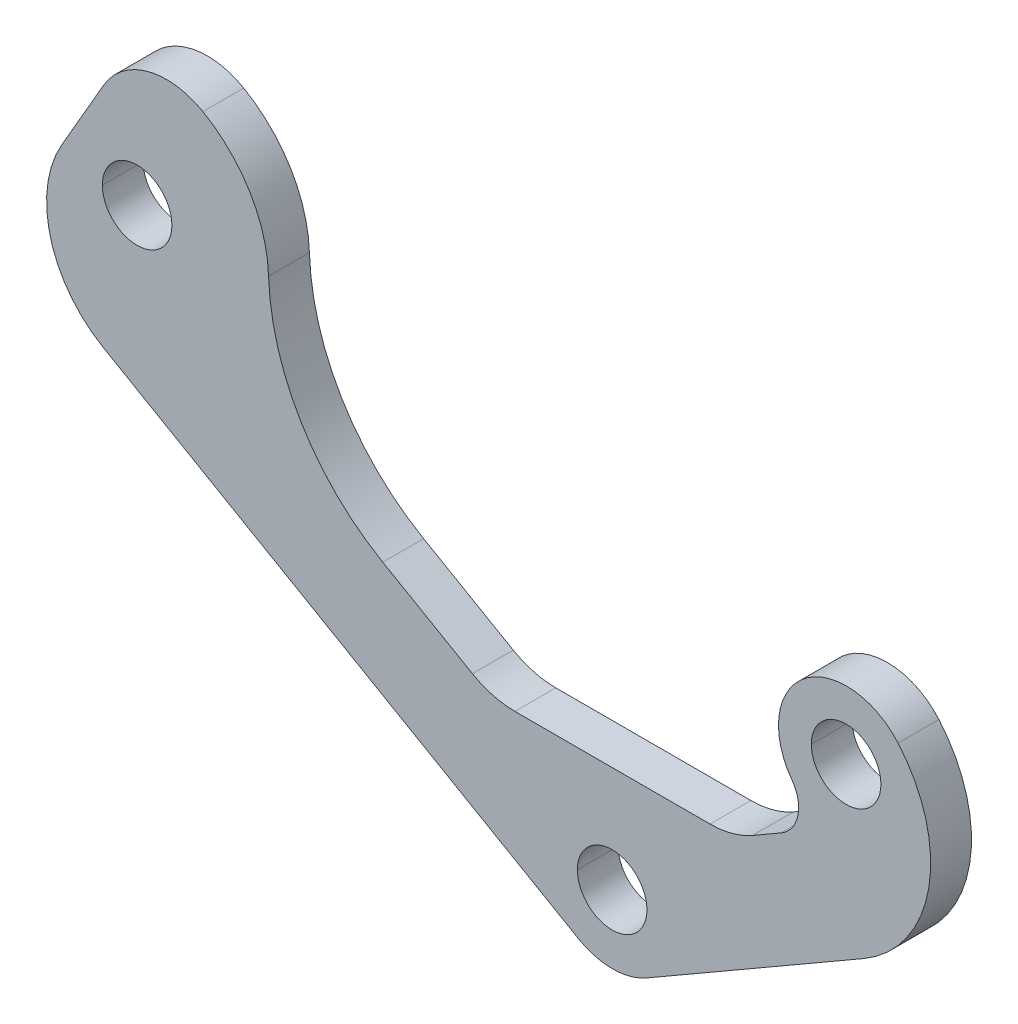
ISO-10303-21;
HEADER;
FILE_DESCRIPTION(('STEP AP214'),'2;1');
FILE_NAME('part.step','',(''),(''),'','','');
FILE_SCHEMA(('AUTOMOTIVE_DESIGN { 1 0 10303 214 1 1 1 1 }'));
ENDSEC;
DATA;
#1=APPLICATION_CONTEXT('core data for automotive mechanical design processes');
#2=APPLICATION_PROTOCOL_DEFINITION('international standard','automotive_design',2000,#1);
#3=PRODUCT_CONTEXT('',#1,'mechanical');
#4=PRODUCT('Part','Part','',(#3));
#5=PRODUCT_RELATED_PRODUCT_CATEGORY('part','',(#4));
#6=PRODUCT_DEFINITION_FORMATION('','',#4);
#7=PRODUCT_DEFINITION_CONTEXT('part definition',#1,'design');
#8=PRODUCT_DEFINITION('design','',#6,#7);
#9=PRODUCT_DEFINITION_SHAPE('','',#8);
#10=(LENGTH_UNIT() NAMED_UNIT(*) SI_UNIT(.MILLI.,.METRE.));
#11=(NAMED_UNIT(*) PLANE_ANGLE_UNIT() SI_UNIT($,.RADIAN.));
#12=(NAMED_UNIT(*) SI_UNIT($,.STERADIAN.) SOLID_ANGLE_UNIT());
#13=UNCERTAINTY_MEASURE_WITH_UNIT(LENGTH_MEASURE(1.E-05),#10,'distance_accuracy_value','');
#14=(GEOMETRIC_REPRESENTATION_CONTEXT(3) GLOBAL_UNCERTAINTY_ASSIGNED_CONTEXT((#13)) GLOBAL_UNIT_ASSIGNED_CONTEXT((#10,
#11,#12)) REPRESENTATION_CONTEXT('',''));
#15=CARTESIAN_POINT('',(0.,0.,0.));
#16=DIRECTION('',(0.,0.,1.));
#17=DIRECTION('',(1.,0.,0.));
#18=AXIS2_PLACEMENT_3D('',#15,#16,#17);
#19=CARTESIAN_POINT('',(7.51000105614217,0.660674934064332,-15.42));
#20=DIRECTION('',(0.,0.,1.));
#21=DIRECTION('',(1.,0.,0.));
#22=AXIS2_PLACEMENT_3D('',#19,#20,#21);
#23=PLANE('',#22);
#24=CARTESIAN_POINT('',(-2.3,5.71,-15.42));
#25=DIRECTION('',(0.,0.,-1.));
#26=DIRECTION('',(-1.,0.,0.));
#27=AXIS2_PLACEMENT_3D('',#24,#25,#26);
#28=CIRCLE('',#27,0.9741);
#29=CARTESIAN_POINT('',(-3.2741,5.71,-15.42));
#30=VERTEX_POINT('',#29);
#31=CARTESIAN_POINT('',(-1.3259,5.71,-15.42));
#32=VERTEX_POINT('',#31);
#33=EDGE_CURVE('E503',#30,#32,#28,.T.);
#34=ORIENTED_EDGE('',*,*,#33,.T.);
#35=CARTESIAN_POINT('',(-2.3,5.71,-15.42));
#36=DIRECTION('',(0.,0.,-1.));
#37=DIRECTION('',(-1.,0.,0.));
#38=AXIS2_PLACEMENT_3D('',#35,#36,#37);
#39=CIRCLE('',#38,0.9741);
#40=EDGE_CURVE('E677',#32,#30,#39,.T.);
#41=ORIENTED_EDGE('',*,*,#40,.T.);
#42=EDGE_LOOP('',(#34,#41));
#43=FACE_BOUND('',#42,.T.);
#44=CARTESIAN_POINT('',(11.,-4.24,-15.42));
#45=DIRECTION('',(0.,0.,-1.));
#46=DIRECTION('',(-1.,0.,0.));
#47=AXIS2_PLACEMENT_3D('',#44,#45,#46);
#48=CIRCLE('',#47,0.9741);
#49=CARTESIAN_POINT('',(10.0259,-4.24,-15.42));
#50=VERTEX_POINT('',#49);
#51=CARTESIAN_POINT('',(11.9741,-4.24,-15.42));
#52=VERTEX_POINT('',#51);
#53=EDGE_CURVE('E370',#50,#52,#48,.T.);
#54=ORIENTED_EDGE('',*,*,#53,.T.);
#55=CARTESIAN_POINT('',(11.,-4.24,-15.42));
#56=DIRECTION('',(0.,0.,-1.));
#57=DIRECTION('',(-1.,0.,0.));
#58=AXIS2_PLACEMENT_3D('',#55,#56,#57);
#59=CIRCLE('',#58,0.9741);
#60=EDGE_CURVE('E401',#52,#50,#59,.T.);
#61=ORIENTED_EDGE('',*,*,#60,.T.);
#62=EDGE_LOOP('',(#54,#61));
#63=FACE_BOUND('',#62,.T.);
#64=CARTESIAN_POINT('',(17.55,2.08,-15.42));
#65=DIRECTION('',(0.,0.,-1.));
#66=DIRECTION('',(-1.,0.,0.));
#67=AXIS2_PLACEMENT_3D('',#64,#65,#66);
#68=CIRCLE('',#67,0.9741);
#69=CARTESIAN_POINT('',(16.5759,2.08,-15.42));
#70=VERTEX_POINT('',#69);
#71=CARTESIAN_POINT('',(18.5241,2.08,-15.42));
#72=VERTEX_POINT('',#71);
#73=EDGE_CURVE('E371',#70,#72,#68,.T.);
#74=ORIENTED_EDGE('',*,*,#73,.T.);
#75=CARTESIAN_POINT('',(17.55,2.08,-15.42));
#76=DIRECTION('',(0.,0.,-1.));
#77=DIRECTION('',(-1.,0.,0.));
#78=AXIS2_PLACEMENT_3D('',#75,#76,#77);
#79=CIRCLE('',#78,0.9741);
#80=EDGE_CURVE('E508',#72,#70,#79,.T.);
#81=ORIENTED_EDGE('',*,*,#80,.T.);
#82=EDGE_LOOP('',(#74,#81));
#83=FACE_BOUND('',#82,.T.);
#84=CARTESIAN_POINT('',(16.1585293339652,0.866981467125824,-15.42));
#85=DIRECTION('',(0.,0.,-1.));
#86=DIRECTION('',(0.499999997303724,-0.866025405341134,0.));
#87=AXIS2_PLACEMENT_3D('',#84,#85,#86);
#88=CIRCLE('',#87,3.75919999234137);
#89=CARTESIAN_POINT('',(19.00554384,3.32179163999999,-15.42));
#90=VERTEX_POINT('',#89);
#91=CARTESIAN_POINT('',(18.03812932,-2.38858123,-15.42));
#92=VERTEX_POINT('',#91);
#93=EDGE_CURVE('E496',#90,#92,#88,.T.);
#94=ORIENTED_EDGE('',*,*,#93,.F.);
#95=CARTESIAN_POINT('',(17.5627999996952,2.07779999667694,-15.42));
#96=DIRECTION('',(0.,0.,-1.));
#97=DIRECTION('',(0.757345848200842,0.653013986230729,0.));
#98=AXIS2_PLACEMENT_3D('',#95,#96,#97);
#99=CIRCLE('',#98,1.90499999931627);
#100=CARTESIAN_POINT('',(16.02880772,0.9482458,-15.42));
#101=VERTEX_POINT('',#100);
#102=EDGE_CURVE('E21',#101,#90,#99,.T.);
#103=ORIENTED_EDGE('',*,*,#102,.F.);
#104=CARTESIAN_POINT('',(15.2311317334779,0.360877614219627,-15.42));
#105=DIRECTION('',(0.,0.,1.));
#106=DIRECTION('',(0.50000000527427,-0.866025400739337,0.));
#107=AXIS2_PLACEMENT_3D('',#104,#105,#106);
#108=CIRCLE('',#107,0.990600002594888);
#109=CARTESIAN_POINT('',(15.72643174,-0.497007149999999,-15.42));
#110=VERTEX_POINT('',#109);
#111=EDGE_CURVE('E221',#110,#101,#108,.T.);
#112=ORIENTED_EDGE('',*,*,#111,.F.);
#113=DIRECTION('',(0.866025405467971,0.499999997084036,0.));
#114=VECTOR('',#113,1.);
#115=CARTESIAN_POINT('',(15.72643174,-0.49700715,-15.42));
#116=LINE('',#115,#114);
#117=CARTESIAN_POINT('',(14.93147958,-0.95597299,-15.42));
#118=VERTEX_POINT('',#117);
#119=EDGE_CURVE('E224',#118,#110,#116,.T.);
#120=ORIENTED_EDGE('',*,*,#119,.F.);
#121=CARTESIAN_POINT('',(13.7408545541055,1.10625007878791,-15.42));
#122=DIRECTION('',(0.,0.,1.));
#123=DIRECTION('',(1.08743515578238E-08,-1.,0.));
#124=AXIS2_PLACEMENT_3D('',#121,#122,#123);
#125=CIRCLE('',#124,2.38125007878791);
#126=CARTESIAN_POINT('',(13.74085458,-1.275,-15.42));
#127=VERTEX_POINT('',#126);
#128=EDGE_CURVE('E315',#127,#118,#125,.T.);
#129=ORIENTED_EDGE('',*,*,#128,.F.);
#130=DIRECTION('',(1.,0.,0.));
#131=VECTOR('',#130,1.);
#132=CARTESIAN_POINT('',(13.74085458,-1.275,-15.42));
#133=LINE('',#132,#131);
#134=CARTESIAN_POINT('',(8.27834543,-1.275,-15.42));
#135=VERTEX_POINT('',#134);
#136=EDGE_CURVE('E306',#135,#127,#133,.T.);
#137=ORIENTED_EDGE('',*,*,#136,.F.);
#138=CARTESIAN_POINT('',(8.27834545589454,1.10625007878786,-15.42));
#139=DIRECTION('',(0.,0.,1.));
#140=DIRECTION('',(-0.499999994330964,-0.866025407057458,0.));
#141=AXIS2_PLACEMENT_3D('',#138,#139,#140);
#142=CIRCLE('',#141,2.38125007878786);
#143=CARTESIAN_POINT('',(7.08772043,-0.95597299,-15.42));
#144=VERTEX_POINT('',#143);
#145=EDGE_CURVE('E252',#144,#135,#142,.T.);
#146=ORIENTED_EDGE('',*,*,#145,.F.);
#147=DIRECTION('',(0.866025404251055,-0.499999999191797,0.));
#148=VECTOR('',#147,1.);
#149=CARTESIAN_POINT('',(7.08772043,-0.95597299,-15.42));
#150=LINE('',#149,#148);
#151=CARTESIAN_POINT('',(4.57812253,0.49294403,-15.42));
#152=VERTEX_POINT('',#151);
#153=EDGE_CURVE('E302',#152,#144,#150,.T.);
#154=ORIENTED_EDGE('',*,*,#153,.F.);
#155=CARTESIAN_POINT('',(7.77852249617024,6.03619941573465,-15.42));
#156=DIRECTION('',(0.,0.,1.));
#157=DIRECTION('',(-0.999476638757128,-0.032348857456686,0.));
#158=AXIS2_PLACEMENT_3D('',#155,#156,#157);
#159=CIRCLE('',#158,6.40079996679623);
#160=CARTESIAN_POINT('',(1.38107246,5.82914085,-15.42));
#161=VERTEX_POINT('',#160);
#162=EDGE_CURVE('E288',#161,#152,#159,.T.);
#163=ORIENTED_EDGE('',*,*,#162,.F.);
#164=CARTESIAN_POINT('',(-2.30000000670923,5.70999999409976,-15.42));
#165=DIRECTION('',(0.,0.,-1.));
#166=DIRECTION('',(0.999476638636968,0.0323488611692441,0.));
#167=AXIS2_PLACEMENT_3D('',#164,#165,#166);
#168=CIRCLE('',#167,3.68300000661274);
#169=CARTESIAN_POINT('',(-0.4585,8.89957156,-15.42));
#170=VERTEX_POINT('',#169);
#171=EDGE_CURVE('E280',#170,#161,#168,.T.);
#172=ORIENTED_EDGE('',*,*,#171,.F.);
#173=CARTESIAN_POINT('',(-1.47450000129241,7.13980794482333,-15.42));
#174=DIRECTION('',(0.,0.,-1.));
#175=DIRECTION('',(0.500000001609269,0.866025402855327,0.));
#176=AXIS2_PLACEMENT_3D('',#173,#174,#175);
#177=CIRCLE('',#176,2.03199999604474);
#178=CARTESIAN_POINT('',(-3.23426362,8.15580794,-15.42));
#179=VERTEX_POINT('',#178);
#180=EDGE_CURVE('E272',#179,#170,#177,.T.);
#181=ORIENTED_EDGE('',*,*,#180,.F.);
#182=DIRECTION('',(0.500000000256227,0.866025403636506,0.));
#183=VECTOR('',#182,1.);
#184=CARTESIAN_POINT('',(-3.23426362,8.15580794,-15.42));
#185=LINE('',#184,#183);
#186=CARTESIAN_POINT('',(-4.40878449,6.12147812,-15.42));
#187=VERTEX_POINT('',#186);
#188=EDGE_CURVE('E263',#187,#179,#185,.T.);
#189=ORIENTED_EDGE('',*,*,#188,.F.);
#190=CARTESIAN_POINT('',(-1.65915383789321,4.53397812056451,-15.42));
#191=DIRECTION('',(0.,0.,-1.));
#192=DIRECTION('',(-0.866025404262309,0.499999999172305,0.));
#193=AXIS2_PLACEMENT_3D('',#190,#191,#192);
#194=CIRCLE('',#193,3.17500000412684);
#195=CARTESIAN_POINT('',(-3.24665383999999,1.78434746,-15.42));
#196=VERTEX_POINT('',#195);
#197=EDGE_CURVE('E246',#196,#187,#194,.T.);
#198=ORIENTED_EDGE('',*,*,#197,.F.);
#199=DIRECTION('',(-0.866025403643022,0.500000000244941,0.));
#200=VECTOR('',#199,1.);
#201=CARTESIAN_POINT('',(-3.24665384,1.78434746,-15.42));
#202=LINE('',#201,#200);
#203=CARTESIAN_POINT('',(10.05709999,-5.8965784,-15.42));
#204=VERTEX_POINT('',#203);
#205=EDGE_CURVE('E422',#204,#196,#202,.T.);
#206=ORIENTED_EDGE('',*,*,#205,.F.);
#207=CARTESIAN_POINT('',(11.00959999,-4.2468000372097,-15.42));
#208=DIRECTION('',(0.,0.,-1.));
#209=DIRECTION('',(-0.500000007141655,-0.866025399661202,0.));
#210=AXIS2_PLACEMENT_3D('',#207,#208,#209);
#211=CIRCLE('',#210,1.9049999727903);
#212=CARTESIAN_POINT('',(11.96209999,-5.8965784,-15.42));
#213=VERTEX_POINT('',#212);
#214=EDGE_CURVE('E448',#213,#204,#211,.T.);
#215=ORIENTED_EDGE('',*,*,#214,.F.);
#216=DIRECTION('',(-0.866025403739975,-0.500000000077014,0.));
#217=VECTOR('',#216,1.);
#218=CARTESIAN_POINT('',(11.96209999,-5.8965784,-15.42));
#219=LINE('',#218,#217);
#220=EDGE_CURVE('E440',#92,#213,#219,.T.);
#221=ORIENTED_EDGE('',*,*,#220,.F.);
#222=EDGE_LOOP('',(#94,#103,#112,#120,#129,#137,#146,#154,#163,#172,#181,#189,#198,#206,#215,#221));
#223=FACE_BOUND('',#222,.T.);
#224=ADVANCED_FACE('F17',(#43,#63,#83,#223),#23,.T.);
#225=CARTESIAN_POINT('',(7.51000105614217,0.660674934064333,-16.563));
#226=DIRECTION('',(0.,0.,1.));
#227=DIRECTION('',(1.,0.,0.));
#228=AXIS2_PLACEMENT_3D('',#225,#226,#227);
#229=PLANE('',#228);
#230=CARTESIAN_POINT('',(-2.3,5.71,-16.563));
#231=DIRECTION('',(0.,0.,1.));
#232=DIRECTION('',(-1.,0.,0.));
#233=AXIS2_PLACEMENT_3D('',#230,#231,#232);
#234=CIRCLE('',#233,0.9741);
#235=CARTESIAN_POINT('',(-3.2741,5.71,-16.563));
#236=VERTEX_POINT('',#235);
#237=CARTESIAN_POINT('',(-1.3259,5.71,-16.563));
#238=VERTEX_POINT('',#237);
#239=EDGE_CURVE('E410',#236,#238,#234,.T.);
#240=ORIENTED_EDGE('',*,*,#239,.T.);
#241=CARTESIAN_POINT('',(-2.3,5.71,-16.563));
#242=DIRECTION('',(0.,0.,1.));
#243=DIRECTION('',(-1.,0.,0.));
#244=AXIS2_PLACEMENT_3D('',#241,#242,#243);
#245=CIRCLE('',#244,0.9741);
#246=EDGE_CURVE('E394',#238,#236,#245,.T.);
#247=ORIENTED_EDGE('',*,*,#246,.T.);
#248=EDGE_LOOP('',(#240,#247));
#249=FACE_BOUND('',#248,.T.);
#250=CARTESIAN_POINT('',(11.,-4.24,-16.563));
#251=DIRECTION('',(0.,0.,1.));
#252=DIRECTION('',(-1.,0.,0.));
#253=AXIS2_PLACEMENT_3D('',#250,#251,#252);
#254=CIRCLE('',#253,0.9741);
#255=CARTESIAN_POINT('',(10.0259,-4.24,-16.563));
#256=VERTEX_POINT('',#255);
#257=CARTESIAN_POINT('',(11.9741,-4.24,-16.563));
#258=VERTEX_POINT('',#257);
#259=EDGE_CURVE('E376',#256,#258,#254,.T.);
#260=ORIENTED_EDGE('',*,*,#259,.T.);
#261=CARTESIAN_POINT('',(11.,-4.24,-16.563));
#262=DIRECTION('',(0.,0.,1.));
#263=DIRECTION('',(-1.,0.,0.));
#264=AXIS2_PLACEMENT_3D('',#261,#262,#263);
#265=CIRCLE('',#264,0.9741);
#266=EDGE_CURVE('E367',#258,#256,#265,.T.);
#267=ORIENTED_EDGE('',*,*,#266,.T.);
#268=EDGE_LOOP('',(#260,#267));
#269=FACE_BOUND('',#268,.T.);
#270=CARTESIAN_POINT('',(17.55,2.08,-16.563));
#271=DIRECTION('',(0.,0.,1.));
#272=DIRECTION('',(-1.,0.,0.));
#273=AXIS2_PLACEMENT_3D('',#270,#271,#272);
#274=CIRCLE('',#273,0.9741);
#275=CARTESIAN_POINT('',(16.5759,2.08,-16.563));
#276=VERTEX_POINT('',#275);
#277=CARTESIAN_POINT('',(18.5241,2.08,-16.563));
#278=VERTEX_POINT('',#277);
#279=EDGE_CURVE('E523',#276,#278,#274,.T.);
#280=ORIENTED_EDGE('',*,*,#279,.T.);
#281=CARTESIAN_POINT('',(17.55,2.08,-16.563));
#282=DIRECTION('',(0.,0.,1.));
#283=DIRECTION('',(-1.,0.,0.));
#284=AXIS2_PLACEMENT_3D('',#281,#282,#283);
#285=CIRCLE('',#284,0.9741);
#286=EDGE_CURVE('E478',#278,#276,#285,.T.);
#287=ORIENTED_EDGE('',*,*,#286,.T.);
#288=EDGE_LOOP('',(#280,#287));
#289=FACE_BOUND('',#288,.T.);
#290=CARTESIAN_POINT('',(17.5627999996952,2.07779999667694,-16.563));
#291=DIRECTION('',(0.,0.,1.));
#292=DIRECTION('',(0.757345848200842,0.653013986230729,0.));
#293=AXIS2_PLACEMENT_3D('',#290,#291,#292);
#294=CIRCLE('',#293,1.90499999931627);
#295=CARTESIAN_POINT('',(19.00554384,3.32179163999999,-16.563));
#296=VERTEX_POINT('',#295);
#297=CARTESIAN_POINT('',(16.02880772,0.9482458,-16.563));
#298=VERTEX_POINT('',#297);
#299=EDGE_CURVE('E11',#296,#298,#294,.T.);
#300=ORIENTED_EDGE('',*,*,#299,.F.);
#301=CARTESIAN_POINT('',(16.1585293339652,0.866981467125824,-16.563));
#302=DIRECTION('',(0.,0.,1.));
#303=DIRECTION('',(0.499999997303724,-0.866025405341134,0.));
#304=AXIS2_PLACEMENT_3D('',#301,#302,#303);
#305=CIRCLE('',#304,3.75919999234137);
#306=CARTESIAN_POINT('',(18.03812932,-2.38858123,-16.563));
#307=VERTEX_POINT('',#306);
#308=EDGE_CURVE('E472',#307,#296,#305,.T.);
#309=ORIENTED_EDGE('',*,*,#308,.F.);
#310=DIRECTION('',(0.866025403739975,0.500000000077014,0.));
#311=VECTOR('',#310,1.);
#312=CARTESIAN_POINT('',(11.96209999,-5.8965784,-16.563));
#313=LINE('',#312,#311);
#314=CARTESIAN_POINT('',(11.96209999,-5.8965784,-16.563));
#315=VERTEX_POINT('',#314);
#316=EDGE_CURVE('E439',#315,#307,#313,.T.);
#317=ORIENTED_EDGE('',*,*,#316,.F.);
#318=CARTESIAN_POINT('',(11.00959999,-4.2468000372097,-16.563));
#319=DIRECTION('',(0.,0.,1.));
#320=DIRECTION('',(-0.500000007141655,-0.866025399661202,0.));
#321=AXIS2_PLACEMENT_3D('',#318,#319,#320);
#322=CIRCLE('',#321,1.9049999727903);
#323=CARTESIAN_POINT('',(10.05709999,-5.8965784,-16.563));
#324=VERTEX_POINT('',#323);
#325=EDGE_CURVE('E420',#324,#315,#322,.T.);
#326=ORIENTED_EDGE('',*,*,#325,.F.);
#327=DIRECTION('',(0.866025403643022,-0.500000000244941,0.));
#328=VECTOR('',#327,1.);
#329=CARTESIAN_POINT('',(-3.24665384,1.78434746,-16.563));
#330=LINE('',#329,#328);
#331=CARTESIAN_POINT('',(-3.24665383999999,1.78434746,-16.563));
#332=VERTEX_POINT('',#331);
#333=EDGE_CURVE('E243',#332,#324,#330,.T.);
#334=ORIENTED_EDGE('',*,*,#333,.F.);
#335=CARTESIAN_POINT('',(-1.65915383789321,4.53397812056451,-16.563));
#336=DIRECTION('',(0.,0.,1.));
#337=DIRECTION('',(-0.866025404262309,0.499999999172305,0.));
#338=AXIS2_PLACEMENT_3D('',#335,#336,#337);
#339=CIRCLE('',#338,3.17500000412684);
#340=CARTESIAN_POINT('',(-4.40878449,6.12147812,-16.563));
#341=VERTEX_POINT('',#340);
#342=EDGE_CURVE('E260',#341,#332,#339,.T.);
#343=ORIENTED_EDGE('',*,*,#342,.F.);
#344=DIRECTION('',(-0.500000000256227,-0.866025403636506,0.));
#345=VECTOR('',#344,1.);
#346=CARTESIAN_POINT('',(-3.23426362,8.15580794,-16.563));
#347=LINE('',#346,#345);
#348=CARTESIAN_POINT('',(-3.23426362,8.15580794,-16.563));
#349=VERTEX_POINT('',#348);
#350=EDGE_CURVE('E270',#349,#341,#347,.T.);
#351=ORIENTED_EDGE('',*,*,#350,.F.);
#352=CARTESIAN_POINT('',(-1.47450000129241,7.13980794482333,-16.563));
#353=DIRECTION('',(0.,0.,1.));
#354=DIRECTION('',(0.500000001609269,0.866025402855327,0.));
#355=AXIS2_PLACEMENT_3D('',#352,#353,#354);
#356=CIRCLE('',#355,2.03199999604474);
#357=CARTESIAN_POINT('',(-0.4585,8.89957156,-16.563));
#358=VERTEX_POINT('',#357);
#359=EDGE_CURVE('E277',#358,#349,#356,.T.);
#360=ORIENTED_EDGE('',*,*,#359,.F.);
#361=CARTESIAN_POINT('',(-2.30000000670923,5.70999999409976,-16.563));
#362=DIRECTION('',(0.,0.,1.));
#363=DIRECTION('',(0.999476638636968,0.0323488611692441,0.));
#364=AXIS2_PLACEMENT_3D('',#361,#362,#363);
#365=CIRCLE('',#364,3.68300000661274);
#366=CARTESIAN_POINT('',(1.38107246,5.82914085,-16.563));
#367=VERTEX_POINT('',#366);
#368=EDGE_CURVE('E285',#367,#358,#365,.T.);
#369=ORIENTED_EDGE('',*,*,#368,.F.);
#370=CARTESIAN_POINT('',(7.77852249617024,6.03619941573465,-16.563));
#371=DIRECTION('',(0.,0.,1.));
#372=DIRECTION('',(-0.999476638757128,-0.032348857456686,0.));
#373=AXIS2_PLACEMENT_3D('',#370,#371,#372);
#374=CIRCLE('',#373,6.40079996679623);
#375=CARTESIAN_POINT('',(4.57812253,0.49294403,-16.563));
#376=VERTEX_POINT('',#375);
#377=EDGE_CURVE('E296',#367,#376,#374,.T.);
#378=ORIENTED_EDGE('',*,*,#377,.T.);
#379=DIRECTION('',(-0.866025404251055,0.499999999191797,0.));
#380=VECTOR('',#379,1.);
#381=CARTESIAN_POINT('',(7.08772043,-0.95597299,-16.563));
#382=LINE('',#381,#380);
#383=CARTESIAN_POINT('',(7.08772043,-0.95597299,-16.563));
#384=VERTEX_POINT('',#383);
#385=EDGE_CURVE('E301',#384,#376,#382,.T.);
#386=ORIENTED_EDGE('',*,*,#385,.F.);
#387=CARTESIAN_POINT('',(8.27834545589454,1.10625007878786,-16.563));
#388=DIRECTION('',(0.,0.,1.));
#389=DIRECTION('',(-0.499999994330964,-0.866025407057458,0.));
#390=AXIS2_PLACEMENT_3D('',#387,#388,#389);
#391=CIRCLE('',#390,2.38125007878786);
#392=CARTESIAN_POINT('',(8.27834543,-1.275,-16.563));
#393=VERTEX_POINT('',#392);
#394=EDGE_CURVE('E251',#384,#393,#391,.T.);
#395=ORIENTED_EDGE('',*,*,#394,.T.);
#396=DIRECTION('',(-1.,0.,0.));
#397=VECTOR('',#396,1.);
#398=CARTESIAN_POINT('',(13.74085458,-1.275,-16.563));
#399=LINE('',#398,#397);
#400=CARTESIAN_POINT('',(13.74085458,-1.275,-16.563));
#401=VERTEX_POINT('',#400);
#402=EDGE_CURVE('E314',#401,#393,#399,.T.);
#403=ORIENTED_EDGE('',*,*,#402,.F.);
#404=CARTESIAN_POINT('',(13.7408545541055,1.10625007878791,-16.563));
#405=DIRECTION('',(0.,0.,1.));
#406=DIRECTION('',(1.08743515578238E-08,-1.,0.));
#407=AXIS2_PLACEMENT_3D('',#404,#405,#406);
#408=CIRCLE('',#407,2.38125007878791);
#409=CARTESIAN_POINT('',(14.93147958,-0.95597299,-16.563));
#410=VERTEX_POINT('',#409);
#411=EDGE_CURVE('E216',#401,#410,#408,.T.);
#412=ORIENTED_EDGE('',*,*,#411,.T.);
#413=DIRECTION('',(-0.866025405467971,-0.499999997084036,0.));
#414=VECTOR('',#413,1.);
#415=CARTESIAN_POINT('',(15.72643174,-0.49700715,-16.563));
#416=LINE('',#415,#414);
#417=CARTESIAN_POINT('',(15.72643174,-0.497007149999999,-16.563));
#418=VERTEX_POINT('',#417);
#419=EDGE_CURVE('E214',#418,#410,#416,.T.);
#420=ORIENTED_EDGE('',*,*,#419,.F.);
#421=CARTESIAN_POINT('',(15.2311317334779,0.360877614219627,-16.563));
#422=DIRECTION('',(0.,0.,1.));
#423=DIRECTION('',(0.50000000527427,-0.866025400739337,0.));
#424=AXIS2_PLACEMENT_3D('',#421,#422,#423);
#425=CIRCLE('',#424,0.990600002594888);
#426=EDGE_CURVE('E202',#418,#298,#425,.T.);
#427=ORIENTED_EDGE('',*,*,#426,.T.);
#428=EDGE_LOOP('',(#300,#309,#317,#326,#334,#343,#351,#360,#369,#378,#386,#395,#403,#412,#420,#427));
#429=FACE_BOUND('',#428,.T.);
#430=ADVANCED_FACE('F19',(#249,#269,#289,#429),#229,.F.);
#431=CARTESIAN_POINT('',(17.5627999996952,2.07779999667694,-16.563));
#432=DIRECTION('',(0.,0.,1.));
#433=DIRECTION('',(0.757345848200842,0.653013986230729,0.));
#434=AXIS2_PLACEMENT_3D('',#431,#432,#433);
#435=CYLINDRICAL_SURFACE('',#434,1.90499999931627);
#436=ORIENTED_EDGE('',*,*,#102,.T.);
#437=DIRECTION('',(0.,0.,1.));
#438=VECTOR('',#437,1.);
#439=CARTESIAN_POINT('',(19.00554384,3.32179163999999,-16.563));
#440=LINE('',#439,#438);
#441=EDGE_CURVE('E468',#296,#90,#440,.T.);
#442=ORIENTED_EDGE('',*,*,#441,.F.);
#443=ORIENTED_EDGE('',*,*,#299,.T.);
#444=DIRECTION('',(0.,0.,1.));
#445=VECTOR('',#444,1.);
#446=CARTESIAN_POINT('',(16.02880772,0.9482458,-16.563));
#447=LINE('',#446,#445);
#448=EDGE_CURVE('E209',#298,#101,#447,.T.);
#449=ORIENTED_EDGE('',*,*,#448,.T.);
#450=EDGE_LOOP('',(#436,#442,#443,#449));
#451=FACE_BOUND('',#450,.T.);
#452=ADVANCED_FACE('F922',(#451),#435,.T.);
#453=CARTESIAN_POINT('',(15.2311317334779,0.360877614219627,-16.563));
#454=DIRECTION('',(0.,0.,1.));
#455=DIRECTION('',(0.50000000527427,-0.866025400739337,0.));
#456=AXIS2_PLACEMENT_3D('',#453,#454,#455);
#457=CYLINDRICAL_SURFACE('',#456,0.990600002594888);
#458=ORIENTED_EDGE('',*,*,#111,.T.);
#459=ORIENTED_EDGE('',*,*,#448,.F.);
#460=ORIENTED_EDGE('',*,*,#426,.F.);
#461=DIRECTION('',(0.,0.,1.));
#462=VECTOR('',#461,1.);
#463=CARTESIAN_POINT('',(15.72643174,-0.497007149999999,-16.563));
#464=LINE('',#463,#462);
#465=EDGE_CURVE('E207',#418,#110,#464,.T.);
#466=ORIENTED_EDGE('',*,*,#465,.T.);
#467=EDGE_LOOP('',(#458,#459,#460,#466));
#468=FACE_BOUND('',#467,.T.);
#469=ADVANCED_FACE('F205',(#468),#457,.F.);
#470=CARTESIAN_POINT('',(15.32895566,-0.72649007,-16.563));
#471=DIRECTION('',(-0.499999997084036,0.866025405467971,0.));
#472=DIRECTION('',(0.,0.,1.));
#473=AXIS2_PLACEMENT_3D('',#470,#471,#472);
#474=PLANE('',#473);
#475=ORIENTED_EDGE('',*,*,#119,.T.);
#476=ORIENTED_EDGE('',*,*,#465,.F.);
#477=ORIENTED_EDGE('',*,*,#419,.T.);
#478=DIRECTION('',(0.,0.,1.));
#479=VECTOR('',#478,1.);
#480=CARTESIAN_POINT('',(14.93147958,-0.95597299,-16.563));
#481=LINE('',#480,#479);
#482=EDGE_CURVE('E318',#410,#118,#481,.T.);
#483=ORIENTED_EDGE('',*,*,#482,.T.);
#484=EDGE_LOOP('',(#475,#476,#477,#483));
#485=FACE_BOUND('',#484,.T.);
#486=ADVANCED_FACE('F223',(#485),#474,.T.);
#487=CARTESIAN_POINT('',(13.7408545541055,1.10625007878791,-16.563));
#488=DIRECTION('',(0.,0.,1.));
#489=DIRECTION('',(1.08743515578238E-08,-1.,0.));
#490=AXIS2_PLACEMENT_3D('',#487,#488,#489);
#491=CYLINDRICAL_SURFACE('',#490,2.38125007878791);
#492=ORIENTED_EDGE('',*,*,#128,.T.);
#493=ORIENTED_EDGE('',*,*,#482,.F.);
#494=ORIENTED_EDGE('',*,*,#411,.F.);
#495=DIRECTION('',(0.,0.,1.));
#496=VECTOR('',#495,1.);
#497=CARTESIAN_POINT('',(13.74085458,-1.275,-16.563));
#498=LINE('',#497,#496);
#499=EDGE_CURVE('E310',#401,#127,#498,.T.);
#500=ORIENTED_EDGE('',*,*,#499,.T.);
#501=EDGE_LOOP('',(#492,#493,#494,#500));
#502=FACE_BOUND('',#501,.T.);
#503=ADVANCED_FACE('F895',(#502),#491,.F.);
#504=CARTESIAN_POINT('',(11.009600005,-1.275,-16.563));
#505=DIRECTION('',(0.,1.,0.));
#506=DIRECTION('',(1.,0.,0.));
#507=AXIS2_PLACEMENT_3D('',#504,#505,#506);
#508=PLANE('',#507);
#509=ORIENTED_EDGE('',*,*,#136,.T.);
#510=ORIENTED_EDGE('',*,*,#499,.F.);
#511=ORIENTED_EDGE('',*,*,#402,.T.);
#512=DIRECTION('',(0.,0.,1.));
#513=VECTOR('',#512,1.);
#514=CARTESIAN_POINT('',(8.27834543,-1.275,-16.563));
#515=LINE('',#514,#513);
#516=EDGE_CURVE('E247',#393,#135,#515,.T.);
#517=ORIENTED_EDGE('',*,*,#516,.T.);
#518=EDGE_LOOP('',(#509,#510,#511,#517));
#519=FACE_BOUND('',#518,.T.);
#520=ADVANCED_FACE('F885',(#519),#508,.T.);
#521=CARTESIAN_POINT('',(8.27834545589454,1.10625007878786,-16.563));
#522=DIRECTION('',(0.,0.,1.));
#523=DIRECTION('',(-0.499999994330964,-0.866025407057458,0.));
#524=AXIS2_PLACEMENT_3D('',#521,#522,#523);
#525=CYLINDRICAL_SURFACE('',#524,2.38125007878786);
#526=ORIENTED_EDGE('',*,*,#145,.T.);
#527=ORIENTED_EDGE('',*,*,#516,.F.);
#528=ORIENTED_EDGE('',*,*,#394,.F.);
#529=DIRECTION('',(0.,0.,1.));
#530=VECTOR('',#529,1.);
#531=CARTESIAN_POINT('',(7.08772043,-0.95597299,-16.563));
#532=LINE('',#531,#530);
#533=EDGE_CURVE('E297',#384,#144,#532,.T.);
#534=ORIENTED_EDGE('',*,*,#533,.T.);
#535=EDGE_LOOP('',(#526,#527,#528,#534));
#536=FACE_BOUND('',#535,.T.);
#537=ADVANCED_FACE('F806',(#536),#525,.F.);
#538=CARTESIAN_POINT('',(5.83292148,-0.23151448,-16.563));
#539=DIRECTION('',(0.499999999191797,0.866025404251055,0.));
#540=DIRECTION('',(0.,0.,-1.));
#541=AXIS2_PLACEMENT_3D('',#538,#539,#540);
#542=PLANE('',#541);
#543=ORIENTED_EDGE('',*,*,#153,.T.);
#544=ORIENTED_EDGE('',*,*,#533,.F.);
#545=ORIENTED_EDGE('',*,*,#385,.T.);
#546=DIRECTION('',(0.,0.,1.));
#547=VECTOR('',#546,1.);
#548=CARTESIAN_POINT('',(4.57812253,0.49294403,-16.563));
#549=LINE('',#548,#547);
#550=EDGE_CURVE('E292',#376,#152,#549,.T.);
#551=ORIENTED_EDGE('',*,*,#550,.T.);
#552=EDGE_LOOP('',(#543,#544,#545,#551));
#553=FACE_BOUND('',#552,.T.);
#554=ADVANCED_FACE('F802',(#553),#542,.T.);
#555=CARTESIAN_POINT('',(7.77852249617024,6.03619941573465,-16.563));
#556=DIRECTION('',(0.,0.,1.));
#557=DIRECTION('',(-0.999476638757128,-0.032348857456686,0.));
#558=AXIS2_PLACEMENT_3D('',#555,#556,#557);
#559=CYLINDRICAL_SURFACE('',#558,6.40079996679623);
#560=ORIENTED_EDGE('',*,*,#162,.T.);
#561=ORIENTED_EDGE('',*,*,#550,.F.);
#562=ORIENTED_EDGE('',*,*,#377,.F.);
#563=DIRECTION('',(0.,0.,1.));
#564=VECTOR('',#563,1.);
#565=CARTESIAN_POINT('',(1.38107246,5.82914085,-16.563));
#566=LINE('',#565,#564);
#567=EDGE_CURVE('E284',#367,#161,#566,.T.);
#568=ORIENTED_EDGE('',*,*,#567,.T.);
#569=EDGE_LOOP('',(#560,#561,#562,#568));
#570=FACE_BOUND('',#569,.T.);
#571=ADVANCED_FACE('F765',(#570),#559,.F.);
#572=CARTESIAN_POINT('',(-2.30000000670923,5.70999999409976,-16.563));
#573=DIRECTION('',(0.,0.,1.));
#574=DIRECTION('',(0.999476638636968,0.0323488611692441,0.));
#575=AXIS2_PLACEMENT_3D('',#572,#573,#574);
#576=CYLINDRICAL_SURFACE('',#575,3.68300000661274);
#577=ORIENTED_EDGE('',*,*,#171,.T.);
#578=ORIENTED_EDGE('',*,*,#567,.F.);
#579=ORIENTED_EDGE('',*,*,#368,.T.);
#580=DIRECTION('',(0.,0.,1.));
#581=VECTOR('',#580,1.);
#582=CARTESIAN_POINT('',(-0.4585,8.89957156,-16.563));
#583=LINE('',#582,#581);
#584=EDGE_CURVE('E276',#358,#170,#583,.T.);
#585=ORIENTED_EDGE('',*,*,#584,.T.);
#586=EDGE_LOOP('',(#577,#578,#579,#585));
#587=FACE_BOUND('',#586,.T.);
#588=ADVANCED_FACE('F760',(#587),#576,.T.);
#589=CARTESIAN_POINT('',(-1.47450000129241,7.13980794482333,-16.563));
#590=DIRECTION('',(0.,0.,1.));
#591=DIRECTION('',(0.500000001609269,0.866025402855327,0.));
#592=AXIS2_PLACEMENT_3D('',#589,#590,#591);
#593=CYLINDRICAL_SURFACE('',#592,2.03199999604474);
#594=ORIENTED_EDGE('',*,*,#180,.T.);
#595=ORIENTED_EDGE('',*,*,#584,.F.);
#596=ORIENTED_EDGE('',*,*,#359,.T.);
#597=DIRECTION('',(0.,0.,1.));
#598=VECTOR('',#597,1.);
#599=CARTESIAN_POINT('',(-3.23426362,8.15580794,-16.563));
#600=LINE('',#599,#598);
#601=EDGE_CURVE('E267',#349,#179,#600,.T.);
#602=ORIENTED_EDGE('',*,*,#601,.T.);
#603=EDGE_LOOP('',(#594,#595,#596,#602));
#604=FACE_BOUND('',#603,.T.);
#605=ADVANCED_FACE('F764',(#604),#593,.T.);
#606=CARTESIAN_POINT('',(-3.821524055,7.13864303,-16.563));
#607=DIRECTION('',(-0.866025403636506,0.500000000256227,0.));
#608=DIRECTION('',(0.,0.,1.));
#609=AXIS2_PLACEMENT_3D('',#606,#607,#608);
#610=PLANE('',#609);
#611=ORIENTED_EDGE('',*,*,#188,.T.);
#612=ORIENTED_EDGE('',*,*,#601,.F.);
#613=ORIENTED_EDGE('',*,*,#350,.T.);
#614=DIRECTION('',(0.,0.,1.));
#615=VECTOR('',#614,1.);
#616=CARTESIAN_POINT('',(-4.40878449,6.12147812,-16.563));
#617=LINE('',#616,#615);
#618=EDGE_CURVE('E256',#341,#187,#617,.T.);
#619=ORIENTED_EDGE('',*,*,#618,.T.);
#620=EDGE_LOOP('',(#611,#612,#613,#619));
#621=FACE_BOUND('',#620,.T.);
#622=ADVANCED_FACE('F743',(#621),#610,.T.);
#623=CARTESIAN_POINT('',(-1.65915383789321,4.53397812056451,-16.563));
#624=DIRECTION('',(0.,0.,1.));
#625=DIRECTION('',(-0.866025404262309,0.499999999172305,0.));
#626=AXIS2_PLACEMENT_3D('',#623,#624,#625);
#627=CYLINDRICAL_SURFACE('',#626,3.17500000412684);
#628=ORIENTED_EDGE('',*,*,#197,.T.);
#629=ORIENTED_EDGE('',*,*,#618,.F.);
#630=ORIENTED_EDGE('',*,*,#342,.T.);
#631=DIRECTION('',(0.,0.,1.));
#632=VECTOR('',#631,1.);
#633=CARTESIAN_POINT('',(-3.24665383999999,1.78434746,-16.563));
#634=LINE('',#633,#632);
#635=EDGE_CURVE('E241',#332,#196,#634,.T.);
#636=ORIENTED_EDGE('',*,*,#635,.T.);
#637=EDGE_LOOP('',(#628,#629,#630,#636));
#638=FACE_BOUND('',#637,.T.);
#639=ADVANCED_FACE('F739',(#638),#627,.T.);
#640=CARTESIAN_POINT('',(3.405223075,-2.05611547,-16.563));
#641=DIRECTION('',(-0.500000000244941,-0.866025403643022,0.));
#642=DIRECTION('',(-0.866025403643022,0.500000000244941,0.));
#643=AXIS2_PLACEMENT_3D('',#640,#641,#642);
#644=PLANE('',#643);
#645=ORIENTED_EDGE('',*,*,#205,.T.);
#646=ORIENTED_EDGE('',*,*,#635,.F.);
#647=ORIENTED_EDGE('',*,*,#333,.T.);
#648=DIRECTION('',(0.,0.,1.));
#649=VECTOR('',#648,1.);
#650=CARTESIAN_POINT('',(10.05709999,-5.8965784,-16.563));
#651=LINE('',#650,#649);
#652=EDGE_CURVE('E423',#324,#204,#651,.T.);
#653=ORIENTED_EDGE('',*,*,#652,.T.);
#654=EDGE_LOOP('',(#645,#646,#647,#653));
#655=FACE_BOUND('',#654,.T.);
#656=ADVANCED_FACE('F722',(#655),#644,.T.);
#657=CARTESIAN_POINT('',(11.00959999,-4.2468000372097,-16.563));
#658=DIRECTION('',(0.,0.,1.));
#659=DIRECTION('',(-0.500000007141655,-0.866025399661202,0.));
#660=AXIS2_PLACEMENT_3D('',#657,#658,#659);
#661=CYLINDRICAL_SURFACE('',#660,1.9049999727903);
#662=ORIENTED_EDGE('',*,*,#214,.T.);
#663=ORIENTED_EDGE('',*,*,#652,.F.);
#664=ORIENTED_EDGE('',*,*,#325,.T.);
#665=DIRECTION('',(0.,0.,1.));
#666=VECTOR('',#665,1.);
#667=CARTESIAN_POINT('',(11.96209999,-5.8965784,-16.563));
#668=LINE('',#667,#666);
#669=EDGE_CURVE('E435',#315,#213,#668,.T.);
#670=ORIENTED_EDGE('',*,*,#669,.T.);
#671=EDGE_LOOP('',(#662,#663,#664,#670));
#672=FACE_BOUND('',#671,.T.);
#673=ADVANCED_FACE('F717',(#672),#661,.T.);
#674=CARTESIAN_POINT('',(15.000114655,-4.142579815,-16.563));
#675=DIRECTION('',(0.500000000077014,-0.866025403739975,0.));
#676=DIRECTION('',(0.,0.,-1.));
#677=AXIS2_PLACEMENT_3D('',#674,#675,#676);
#678=PLANE('',#677);
#679=ORIENTED_EDGE('',*,*,#220,.T.);
#680=ORIENTED_EDGE('',*,*,#669,.F.);
#681=ORIENTED_EDGE('',*,*,#316,.T.);
#682=DIRECTION('',(0.,0.,1.));
#683=VECTOR('',#682,1.);
#684=CARTESIAN_POINT('',(18.03812932,-2.38858123,-16.563));
#685=LINE('',#684,#683);
#686=EDGE_CURVE('E492',#307,#92,#685,.T.);
#687=ORIENTED_EDGE('',*,*,#686,.T.);
#688=EDGE_LOOP('',(#679,#680,#681,#687));
#689=FACE_BOUND('',#688,.T.);
#690=ADVANCED_FACE('F721',(#689),#678,.T.);
#691=CARTESIAN_POINT('',(16.1585293339652,0.866981467125824,-16.563));
#692=DIRECTION('',(0.,0.,1.));
#693=DIRECTION('',(0.499999997303724,-0.866025405341134,0.));
#694=AXIS2_PLACEMENT_3D('',#691,#692,#693);
#695=CYLINDRICAL_SURFACE('',#694,3.75919999234137);
#696=ORIENTED_EDGE('',*,*,#93,.T.);
#697=ORIENTED_EDGE('',*,*,#686,.F.);
#698=ORIENTED_EDGE('',*,*,#308,.T.);
#699=ORIENTED_EDGE('',*,*,#441,.T.);
#700=EDGE_LOOP('',(#696,#697,#698,#699));
#701=FACE_BOUND('',#700,.T.);
#702=ADVANCED_FACE('F795',(#701),#695,.T.);
#703=CARTESIAN_POINT('',(-2.3,5.71,-15.9915));
#704=DIRECTION('',(0.,0.,1.));
#705=DIRECTION('',(-1.,0.,0.));
#706=AXIS2_PLACEMENT_3D('',#703,#704,#705);
#707=CYLINDRICAL_SURFACE('',#706,0.9741);
#708=DIRECTION('',(0.,0.,-1.));
#709=VECTOR('',#708,1.);
#710=CARTESIAN_POINT('',(-3.2741,5.71,-15.9915));
#711=LINE('',#710,#709);
#712=EDGE_CURVE('E689',#30,#236,#711,.T.);
#713=ORIENTED_EDGE('',*,*,#712,.T.);
#714=ORIENTED_EDGE('',*,*,#246,.F.);
#715=DIRECTION('',(0.,0.,1.));
#716=VECTOR('',#715,1.);
#717=CARTESIAN_POINT('',(-1.3259,5.71,-15.9915));
#718=LINE('',#717,#716);
#719=EDGE_CURVE('E672',#238,#32,#718,.T.);
#720=ORIENTED_EDGE('',*,*,#719,.T.);
#721=ORIENTED_EDGE('',*,*,#33,.F.);
#722=EDGE_LOOP('',(#713,#714,#720,#721));
#723=FACE_BOUND('',#722,.T.);
#724=ADVANCED_FACE('F785',(#723),#707,.F.);
#725=CARTESIAN_POINT('',(11.,-4.24,-15.9915));
#726=DIRECTION('',(0.,0.,1.));
#727=DIRECTION('',(-1.,0.,0.));
#728=AXIS2_PLACEMENT_3D('',#725,#726,#727);
#729=CYLINDRICAL_SURFACE('',#728,0.9741);
#730=DIRECTION('',(0.,0.,-1.));
#731=VECTOR('',#730,1.);
#732=CARTESIAN_POINT('',(10.0259,-4.24,-15.9915));
#733=LINE('',#732,#731);
#734=EDGE_CURVE('E406',#50,#256,#733,.T.);
#735=ORIENTED_EDGE('',*,*,#734,.T.);
#736=ORIENTED_EDGE('',*,*,#266,.F.);
#737=DIRECTION('',(0.,0.,1.));
#738=VECTOR('',#737,1.);
#739=CARTESIAN_POINT('',(11.9741,-4.24,-15.9915));
#740=LINE('',#739,#738);
#741=EDGE_CURVE('E380',#258,#52,#740,.T.);
#742=ORIENTED_EDGE('',*,*,#741,.T.);
#743=ORIENTED_EDGE('',*,*,#53,.F.);
#744=EDGE_LOOP('',(#735,#736,#742,#743));
#745=FACE_BOUND('',#744,.T.);
#746=ADVANCED_FACE('F775',(#745),#729,.F.);
#747=CARTESIAN_POINT('',(17.55,2.08,-15.9915));
#748=DIRECTION('',(0.,0.,1.));
#749=DIRECTION('',(-1.,0.,0.));
#750=AXIS2_PLACEMENT_3D('',#747,#748,#749);
#751=CYLINDRICAL_SURFACE('',#750,0.9741);
#752=DIRECTION('',(0.,0.,-1.));
#753=VECTOR('',#752,1.);
#754=CARTESIAN_POINT('',(16.5759,2.08,-15.9915));
#755=LINE('',#754,#753);
#756=EDGE_CURVE('E379',#70,#276,#755,.T.);
#757=ORIENTED_EDGE('',*,*,#756,.T.);
#758=ORIENTED_EDGE('',*,*,#286,.F.);
#759=DIRECTION('',(0.,0.,1.));
#760=VECTOR('',#759,1.);
#761=CARTESIAN_POINT('',(18.5241,2.08,-15.9915));
#762=LINE('',#761,#760);
#763=EDGE_CURVE('E512',#278,#72,#762,.T.);
#764=ORIENTED_EDGE('',*,*,#763,.T.);
#765=ORIENTED_EDGE('',*,*,#73,.F.);
#766=EDGE_LOOP('',(#757,#758,#764,#765));
#767=FACE_BOUND('',#766,.T.);
#768=ADVANCED_FACE('F753',(#767),#751,.F.);
#769=CARTESIAN_POINT('',(17.55,2.08,-15.9915));
#770=DIRECTION('',(0.,0.,1.));
#771=DIRECTION('',(-1.,0.,0.));
#772=AXIS2_PLACEMENT_3D('',#769,#770,#771);
#773=CYLINDRICAL_SURFACE('',#772,0.9741);
#774=ORIENTED_EDGE('',*,*,#756,.F.);
#775=ORIENTED_EDGE('',*,*,#80,.F.);
#776=ORIENTED_EDGE('',*,*,#763,.F.);
#777=ORIENTED_EDGE('',*,*,#279,.F.);
#778=EDGE_LOOP('',(#774,#775,#776,#777));
#779=FACE_BOUND('',#778,.T.);
#780=ADVANCED_FACE('F732',(#779),#773,.F.);
#781=CARTESIAN_POINT('',(11.,-4.24,-15.9915));
#782=DIRECTION('',(0.,0.,1.));
#783=DIRECTION('',(-1.,0.,0.));
#784=AXIS2_PLACEMENT_3D('',#781,#782,#783);
#785=CYLINDRICAL_SURFACE('',#784,0.9741);
#786=ORIENTED_EDGE('',*,*,#734,.F.);
#787=ORIENTED_EDGE('',*,*,#60,.F.);
#788=ORIENTED_EDGE('',*,*,#741,.F.);
#789=ORIENTED_EDGE('',*,*,#259,.F.);
#790=EDGE_LOOP('',(#786,#787,#788,#789));
#791=FACE_BOUND('',#790,.T.);
#792=ADVANCED_FACE('F709',(#791),#785,.F.);
#793=CARTESIAN_POINT('',(-2.3,5.71,-15.9915));
#794=DIRECTION('',(0.,0.,1.));
#795=DIRECTION('',(-1.,0.,0.));
#796=AXIS2_PLACEMENT_3D('',#793,#794,#795);
#797=CYLINDRICAL_SURFACE('',#796,0.9741);
#798=ORIENTED_EDGE('',*,*,#712,.F.);
#799=ORIENTED_EDGE('',*,*,#40,.F.);
#800=ORIENTED_EDGE('',*,*,#719,.F.);
#801=ORIENTED_EDGE('',*,*,#239,.F.);
#802=EDGE_LOOP('',(#798,#799,#800,#801));
#803=FACE_BOUND('',#802,.T.);
#804=ADVANCED_FACE('F703',(#803),#797,.F.);
#805=CLOSED_SHELL('',(#224,#430,#452,#469,#486,#503,#520,#537,#554,#571,#588,#605,#622,#639,
#656,#673,#690,#702,#724,#746,#768,#780,#792,#804));
#806=MANIFOLD_SOLID_BREP('B1',#805);
#807=ADVANCED_BREP_SHAPE_REPRESENTATION('',(#18,#806),#14);
#808=SHAPE_DEFINITION_REPRESENTATION(#9,#807);
ENDSEC;
END-ISO-10303-21;
